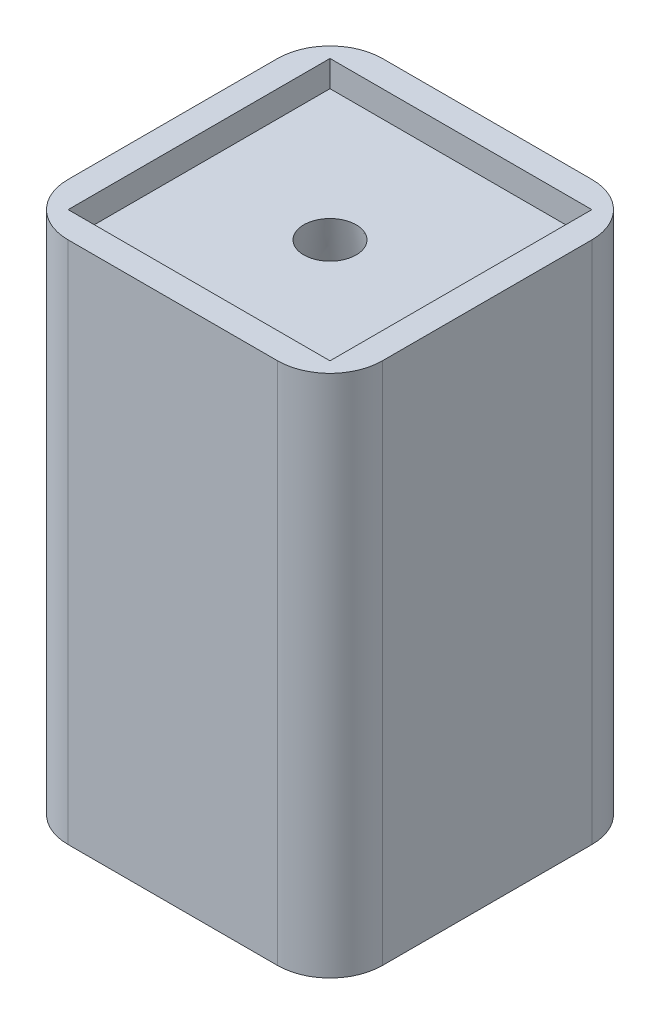
ISO-10303-21;
HEADER;
FILE_DESCRIPTION(('STEP AP214'),'2;1');
FILE_NAME('part.step','',(''),(''),'','','');
FILE_SCHEMA(('AUTOMOTIVE_DESIGN { 1 0 10303 214 1 1 1 1 }'));
ENDSEC;
DATA;
#1=APPLICATION_CONTEXT('core data for automotive mechanical design processes');
#2=APPLICATION_PROTOCOL_DEFINITION('international standard','automotive_design',2000,#1);
#3=PRODUCT_CONTEXT('',#1,'mechanical');
#4=PRODUCT('Part','Part','',(#3));
#5=PRODUCT_RELATED_PRODUCT_CATEGORY('part','',(#4));
#6=PRODUCT_DEFINITION_FORMATION('','',#4);
#7=PRODUCT_DEFINITION_CONTEXT('part definition',#1,'design');
#8=PRODUCT_DEFINITION('design','',#6,#7);
#9=PRODUCT_DEFINITION_SHAPE('','',#8);
#10=(LENGTH_UNIT() NAMED_UNIT(*) SI_UNIT(.MILLI.,.METRE.));
#11=(NAMED_UNIT(*) PLANE_ANGLE_UNIT() SI_UNIT($,.RADIAN.));
#12=(NAMED_UNIT(*) SI_UNIT($,.STERADIAN.) SOLID_ANGLE_UNIT());
#13=UNCERTAINTY_MEASURE_WITH_UNIT(LENGTH_MEASURE(1.E-05),#10,'distance_accuracy_value','');
#14=(GEOMETRIC_REPRESENTATION_CONTEXT(3) GLOBAL_UNCERTAINTY_ASSIGNED_CONTEXT((#13)) GLOBAL_UNIT_ASSIGNED_CONTEXT((#10,
#11,#12)) REPRESENTATION_CONTEXT('',''));
#15=CARTESIAN_POINT('',(0.,0.,0.));
#16=DIRECTION('',(0.,0.,1.));
#17=DIRECTION('',(1.,0.,0.));
#18=AXIS2_PLACEMENT_3D('',#15,#16,#17);
#19=CARTESIAN_POINT('',(0.,47.5,0.));
#20=DIRECTION('',(0.,-1.,0.));
#21=DIRECTION('',(0.,0.,-1.));
#22=AXIS2_PLACEMENT_3D('',#19,#20,#21);
#23=PLANE('',#22);
#24=DIRECTION('',(0.,0.,-1.));
#25=VECTOR('',#24,1.);
#26=CARTESIAN_POINT('',(12.5,47.5,12.5));
#27=LINE('',#26,#25);
#28=CARTESIAN_POINT('',(12.5,47.5,12.5));
#29=VERTEX_POINT('',#28);
#30=CARTESIAN_POINT('',(12.5,47.5,-12.5));
#31=VERTEX_POINT('',#30);
#32=EDGE_CURVE('E136',#29,#31,#27,.T.);
#33=ORIENTED_EDGE('',*,*,#32,.T.);
#34=DIRECTION('',(-1.,0.,0.));
#35=VECTOR('',#34,1.);
#36=CARTESIAN_POINT('',(-12.5,47.5,-12.5));
#37=LINE('',#36,#35);
#38=CARTESIAN_POINT('',(-12.5,47.5,-12.5));
#39=VERTEX_POINT('',#38);
#40=EDGE_CURVE('E147',#31,#39,#37,.T.);
#41=ORIENTED_EDGE('',*,*,#40,.T.);
#42=DIRECTION('',(0.,0.,1.));
#43=VECTOR('',#42,1.);
#44=CARTESIAN_POINT('',(-12.5,47.5,12.5));
#45=LINE('',#44,#43);
#46=CARTESIAN_POINT('',(-12.5,47.5,12.5));
#47=VERTEX_POINT('',#46);
#48=EDGE_CURVE('E152',#39,#47,#45,.T.);
#49=ORIENTED_EDGE('',*,*,#48,.T.);
#50=DIRECTION('',(1.,0.,0.));
#51=VECTOR('',#50,1.);
#52=CARTESIAN_POINT('',(-12.5,47.5,12.5));
#53=LINE('',#52,#51);
#54=EDGE_CURVE('E144',#47,#29,#53,.T.);
#55=ORIENTED_EDGE('',*,*,#54,.T.);
#56=EDGE_LOOP('',(#33,#41,#49,#55));
#57=FACE_BOUND('',#56,.T.);
#58=CARTESIAN_POINT('',(0.,47.5,0.));
#59=DIRECTION('',(0.,1.,0.));
#60=DIRECTION('',(0.,0.,1.));
#61=AXIS2_PLACEMENT_3D('',#58,#59,#60);
#62=CIRCLE('',#61,2.5);
#63=CARTESIAN_POINT('',(0.784484004687969,47.5,-2.37372804811097));
#64=VERTEX_POINT('',#63);
#65=EDGE_CURVE('E162',#64,#64,#62,.T.);
#66=ORIENTED_EDGE('',*,*,#65,.F.);
#67=EDGE_LOOP('',(#66));
#68=FACE_BOUND('',#67,.T.);
#69=ADVANCED_FACE('F41',(#57,#68),#23,.F.);
#70=CARTESIAN_POINT('',(15.,50.,15.));
#71=DIRECTION('',(-1.,0.,0.));
#72=DIRECTION('',(0.,0.,1.));
#73=AXIS2_PLACEMENT_3D('',#70,#71,#72);
#74=PLANE('',#73);
#75=DIRECTION('',(0.,0.,-1.));
#76=VECTOR('',#75,1.);
#77=CARTESIAN_POINT('',(15.,0.,15.));
#78=LINE('',#77,#76);
#79=CARTESIAN_POINT('',(15.,0.,10.));
#80=VERTEX_POINT('',#79);
#81=CARTESIAN_POINT('',(15.,0.,-10.));
#82=VERTEX_POINT('',#81);
#83=EDGE_CURVE('E174',#80,#82,#78,.T.);
#84=ORIENTED_EDGE('',*,*,#83,.T.);
#85=DIRECTION('',(0.,-1.,0.));
#86=VECTOR('',#85,1.);
#87=CARTESIAN_POINT('',(15.,50.,-10.));
#88=LINE('',#87,#86);
#89=CARTESIAN_POINT('',(15.,50.,-10.));
#90=VERTEX_POINT('',#89);
#91=EDGE_CURVE('E214',#82,#90,#88,.F.);
#92=ORIENTED_EDGE('',*,*,#91,.T.);
#93=DIRECTION('',(0.,0.,-1.));
#94=VECTOR('',#93,1.);
#95=CARTESIAN_POINT('',(15.,50.,15.));
#96=LINE('',#95,#94);
#97=CARTESIAN_POINT('',(15.,50.,10.));
#98=VERTEX_POINT('',#97);
#99=EDGE_CURVE('E178',#98,#90,#96,.T.);
#100=ORIENTED_EDGE('',*,*,#99,.F.);
#101=DIRECTION('',(0.,-1.,0.));
#102=VECTOR('',#101,1.);
#103=CARTESIAN_POINT('',(15.,50.,10.));
#104=LINE('',#103,#102);
#105=EDGE_CURVE('E211',#98,#80,#104,.T.);
#106=ORIENTED_EDGE('',*,*,#105,.T.);
#107=EDGE_LOOP('',(#84,#92,#100,#106));
#108=FACE_BOUND('',#107,.T.);
#109=ADVANCED_FACE('F248',(#108),#74,.F.);
#110=CARTESIAN_POINT('',(-15.,50.,-15.));
#111=DIRECTION('',(0.,0.,1.));
#112=DIRECTION('',(1.,0.,0.));
#113=AXIS2_PLACEMENT_3D('',#110,#111,#112);
#114=PLANE('',#113);
#115=DIRECTION('',(-1.,0.,0.));
#116=VECTOR('',#115,1.);
#117=CARTESIAN_POINT('',(-15.,50.,-15.));
#118=LINE('',#117,#116);
#119=CARTESIAN_POINT('',(10.,50.,-15.));
#120=VERTEX_POINT('',#119);
#121=CARTESIAN_POINT('',(-10.,50.,-15.));
#122=VERTEX_POINT('',#121);
#123=EDGE_CURVE('E181',#120,#122,#118,.T.);
#124=ORIENTED_EDGE('',*,*,#123,.F.);
#125=DIRECTION('',(0.,-1.,0.));
#126=VECTOR('',#125,1.);
#127=CARTESIAN_POINT('',(10.,50.,-15.));
#128=LINE('',#127,#126);
#129=CARTESIAN_POINT('',(10.,0.,-15.));
#130=VERTEX_POINT('',#129);
#131=EDGE_CURVE('E200',#120,#130,#128,.T.);
#132=ORIENTED_EDGE('',*,*,#131,.T.);
#133=DIRECTION('',(-1.,0.,0.));
#134=VECTOR('',#133,1.);
#135=CARTESIAN_POINT('',(-15.,0.,-15.));
#136=LINE('',#135,#134);
#137=CARTESIAN_POINT('',(-10.,0.,-15.));
#138=VERTEX_POINT('',#137);
#139=EDGE_CURVE('E192',#130,#138,#136,.T.);
#140=ORIENTED_EDGE('',*,*,#139,.T.);
#141=DIRECTION('',(0.,-1.,0.));
#142=VECTOR('',#141,1.);
#143=CARTESIAN_POINT('',(-10.,50.,-15.));
#144=LINE('',#143,#142);
#145=EDGE_CURVE('E189',#138,#122,#144,.F.);
#146=ORIENTED_EDGE('',*,*,#145,.T.);
#147=EDGE_LOOP('',(#124,#132,#140,#146));
#148=FACE_BOUND('',#147,.T.);
#149=ADVANCED_FACE('F256',(#148),#114,.F.);
#150=CARTESIAN_POINT('',(-15.,50.,15.));
#151=DIRECTION('',(1.,0.,0.));
#152=DIRECTION('',(0.,0.,-1.));
#153=AXIS2_PLACEMENT_3D('',#150,#151,#152);
#154=PLANE('',#153);
#155=DIRECTION('',(0.,0.,1.));
#156=VECTOR('',#155,1.);
#157=CARTESIAN_POINT('',(-15.,50.,15.));
#158=LINE('',#157,#156);
#159=CARTESIAN_POINT('',(-15.,50.,-10.));
#160=VERTEX_POINT('',#159);
#161=CARTESIAN_POINT('',(-15.,50.,10.));
#162=VERTEX_POINT('',#161);
#163=EDGE_CURVE('E185',#160,#162,#158,.T.);
#164=ORIENTED_EDGE('',*,*,#163,.F.);
#165=DIRECTION('',(0.,-1.,0.));
#166=VECTOR('',#165,1.);
#167=CARTESIAN_POINT('',(-15.,50.,-10.));
#168=LINE('',#167,#166);
#169=CARTESIAN_POINT('',(-15.,0.,-10.));
#170=VERTEX_POINT('',#169);
#171=EDGE_CURVE('E12',#160,#170,#168,.T.);
#172=ORIENTED_EDGE('',*,*,#171,.T.);
#173=DIRECTION('',(0.,0.,1.));
#174=VECTOR('',#173,1.);
#175=CARTESIAN_POINT('',(-15.,0.,15.));
#176=LINE('',#175,#174);
#177=CARTESIAN_POINT('',(-15.,0.,10.));
#178=VERTEX_POINT('',#177);
#179=EDGE_CURVE('E195',#170,#178,#176,.T.);
#180=ORIENTED_EDGE('',*,*,#179,.T.);
#181=DIRECTION('',(0.,-1.,0.));
#182=VECTOR('',#181,1.);
#183=CARTESIAN_POINT('',(-15.,50.,10.));
#184=LINE('',#183,#182);
#185=EDGE_CURVE('E49',#178,#162,#184,.F.);
#186=ORIENTED_EDGE('',*,*,#185,.T.);
#187=EDGE_LOOP('',(#164,#172,#180,#186));
#188=FACE_BOUND('',#187,.T.);
#189=ADVANCED_FACE('F229',(#188),#154,.F.);
#190=CARTESIAN_POINT('',(-15.,50.,15.));
#191=DIRECTION('',(0.,0.,-1.));
#192=DIRECTION('',(-1.,0.,0.));
#193=AXIS2_PLACEMENT_3D('',#190,#191,#192);
#194=PLANE('',#193);
#195=DIRECTION('',(1.,0.,0.));
#196=VECTOR('',#195,1.);
#197=CARTESIAN_POINT('',(-15.,0.,15.));
#198=LINE('',#197,#196);
#199=CARTESIAN_POINT('',(-10.,0.,15.));
#200=VERTEX_POINT('',#199);
#201=CARTESIAN_POINT('',(10.,0.,15.));
#202=VERTEX_POINT('',#201);
#203=EDGE_CURVE('E182',#200,#202,#198,.T.);
#204=ORIENTED_EDGE('',*,*,#203,.T.);
#205=DIRECTION('',(0.,-1.,0.));
#206=VECTOR('',#205,1.);
#207=CARTESIAN_POINT('',(10.,50.,15.));
#208=LINE('',#207,#206);
#209=CARTESIAN_POINT('',(10.,50.,15.));
#210=VERTEX_POINT('',#209);
#211=EDGE_CURVE('E56',#202,#210,#208,.F.);
#212=ORIENTED_EDGE('',*,*,#211,.T.);
#213=DIRECTION('',(1.,0.,0.));
#214=VECTOR('',#213,1.);
#215=CARTESIAN_POINT('',(-15.,50.,15.));
#216=LINE('',#215,#214);
#217=CARTESIAN_POINT('',(-10.,50.,15.));
#218=VERTEX_POINT('',#217);
#219=EDGE_CURVE('E187',#218,#210,#216,.T.);
#220=ORIENTED_EDGE('',*,*,#219,.F.);
#221=DIRECTION('',(0.,-1.,0.));
#222=VECTOR('',#221,1.);
#223=CARTESIAN_POINT('',(-10.,50.,15.));
#224=LINE('',#223,#222);
#225=EDGE_CURVE('E223',#218,#200,#224,.T.);
#226=ORIENTED_EDGE('',*,*,#225,.T.);
#227=EDGE_LOOP('',(#204,#212,#220,#226));
#228=FACE_BOUND('',#227,.T.);
#229=ADVANCED_FACE('F237',(#228),#194,.F.);
#230=CARTESIAN_POINT('',(0.,50.,0.));
#231=DIRECTION('',(0.,-1.,0.));
#232=DIRECTION('',(0.,0.,-1.));
#233=AXIS2_PLACEMENT_3D('',#230,#231,#232);
#234=PLANE('',#233);
#235=DIRECTION('',(-1.,0.,0.));
#236=VECTOR('',#235,1.);
#237=CARTESIAN_POINT('',(-12.5,50.,-12.5));
#238=LINE('',#237,#236);
#239=CARTESIAN_POINT('',(12.5,50.,-12.5));
#240=VERTEX_POINT('',#239);
#241=CARTESIAN_POINT('',(-12.5,50.,-12.5));
#242=VERTEX_POINT('',#241);
#243=EDGE_CURVE('E168',#240,#242,#238,.T.);
#244=ORIENTED_EDGE('',*,*,#243,.F.);
#245=DIRECTION('',(0.,0.,-1.));
#246=VECTOR('',#245,1.);
#247=CARTESIAN_POINT('',(12.5,50.,12.5));
#248=LINE('',#247,#246);
#249=CARTESIAN_POINT('',(12.5,50.,12.5));
#250=VERTEX_POINT('',#249);
#251=EDGE_CURVE('E139',#250,#240,#248,.T.);
#252=ORIENTED_EDGE('',*,*,#251,.F.);
#253=DIRECTION('',(1.,0.,0.));
#254=VECTOR('',#253,1.);
#255=CARTESIAN_POINT('',(-12.5,50.,12.5));
#256=LINE('',#255,#254);
#257=CARTESIAN_POINT('',(-12.5,50.,12.5));
#258=VERTEX_POINT('',#257);
#259=EDGE_CURVE('E156',#258,#250,#256,.T.);
#260=ORIENTED_EDGE('',*,*,#259,.F.);
#261=DIRECTION('',(0.,0.,1.));
#262=VECTOR('',#261,1.);
#263=CARTESIAN_POINT('',(-12.5,50.,12.5));
#264=LINE('',#263,#262);
#265=EDGE_CURVE('E159',#242,#258,#264,.T.);
#266=ORIENTED_EDGE('',*,*,#265,.F.);
#267=EDGE_LOOP('',(#244,#252,#260,#266));
#268=FACE_BOUND('',#267,.T.);
#269=ORIENTED_EDGE('',*,*,#99,.T.);
#270=CARTESIAN_POINT('',(10.,50.,-10.));
#271=DIRECTION('',(0.,-1.,0.));
#272=DIRECTION('',(0.,0.,-1.));
#273=AXIS2_PLACEMENT_3D('',#270,#271,#272);
#274=CIRCLE('',#273,5.);
#275=EDGE_CURVE('E221',#90,#120,#274,.F.);
#276=ORIENTED_EDGE('',*,*,#275,.T.);
#277=ORIENTED_EDGE('',*,*,#123,.T.);
#278=CARTESIAN_POINT('',(-10.,50.,-10.));
#279=DIRECTION('',(0.,-1.,0.));
#280=DIRECTION('',(0.,0.,-1.));
#281=AXIS2_PLACEMENT_3D('',#278,#279,#280);
#282=CIRCLE('',#281,5.);
#283=EDGE_CURVE('E217',#122,#160,#282,.F.);
#284=ORIENTED_EDGE('',*,*,#283,.T.);
#285=ORIENTED_EDGE('',*,*,#163,.T.);
#286=CARTESIAN_POINT('',(-10.,50.,10.));
#287=DIRECTION('',(0.,-1.,0.));
#288=DIRECTION('',(0.,0.,-1.));
#289=AXIS2_PLACEMENT_3D('',#286,#287,#288);
#290=CIRCLE('',#289,5.);
#291=EDGE_CURVE('E63',#162,#218,#290,.F.);
#292=ORIENTED_EDGE('',*,*,#291,.T.);
#293=ORIENTED_EDGE('',*,*,#219,.T.);
#294=CARTESIAN_POINT('',(10.,50.,10.));
#295=DIRECTION('',(0.,-1.,0.));
#296=DIRECTION('',(0.,0.,-1.));
#297=AXIS2_PLACEMENT_3D('',#294,#295,#296);
#298=CIRCLE('',#297,5.);
#299=EDGE_CURVE('E219',#210,#98,#298,.F.);
#300=ORIENTED_EDGE('',*,*,#299,.T.);
#301=EDGE_LOOP('',(#269,#276,#277,#284,#285,#292,#293,#300));
#302=FACE_BOUND('',#301,.T.);
#303=ADVANCED_FACE('F233',(#268,#302),#234,.F.);
#304=CARTESIAN_POINT('',(0.,0.,0.));
#305=DIRECTION('',(0.,-1.,0.));
#306=DIRECTION('',(0.,0.,-1.));
#307=AXIS2_PLACEMENT_3D('',#304,#305,#306);
#308=PLANE('',#307);
#309=CARTESIAN_POINT('',(0.,0.,0.));
#310=DIRECTION('',(0.,-1.,0.));
#311=DIRECTION('',(0.,0.,-1.));
#312=AXIS2_PLACEMENT_3D('',#309,#310,#311);
#313=CIRCLE('',#312,12.5);
#314=CARTESIAN_POINT('',(0.,0.,-12.5));
#315=VERTEX_POINT('',#314);
#316=EDGE_CURVE('E399',#315,#315,#313,.T.);
#317=ORIENTED_EDGE('',*,*,#316,.F.);
#318=EDGE_LOOP('',(#317));
#319=FACE_BOUND('',#318,.T.);
#320=ORIENTED_EDGE('',*,*,#139,.F.);
#321=CARTESIAN_POINT('',(10.,0.,-10.));
#322=DIRECTION('',(0.,-1.,0.));
#323=DIRECTION('',(0.,0.,-1.));
#324=AXIS2_PLACEMENT_3D('',#321,#322,#323);
#325=CIRCLE('',#324,5.);
#326=EDGE_CURVE('E209',#130,#82,#325,.T.);
#327=ORIENTED_EDGE('',*,*,#326,.T.);
#328=ORIENTED_EDGE('',*,*,#83,.F.);
#329=CARTESIAN_POINT('',(10.,0.,10.));
#330=DIRECTION('',(0.,-1.,0.));
#331=DIRECTION('',(0.,0.,-1.));
#332=AXIS2_PLACEMENT_3D('',#329,#330,#331);
#333=CIRCLE('',#332,5.);
#334=EDGE_CURVE('E207',#80,#202,#333,.T.);
#335=ORIENTED_EDGE('',*,*,#334,.T.);
#336=ORIENTED_EDGE('',*,*,#203,.F.);
#337=CARTESIAN_POINT('',(-10.,0.,10.));
#338=DIRECTION('',(0.,-1.,0.));
#339=DIRECTION('',(0.,0.,-1.));
#340=AXIS2_PLACEMENT_3D('',#337,#338,#339);
#341=CIRCLE('',#340,5.);
#342=EDGE_CURVE('E203',#200,#178,#341,.T.);
#343=ORIENTED_EDGE('',*,*,#342,.T.);
#344=ORIENTED_EDGE('',*,*,#179,.F.);
#345=CARTESIAN_POINT('',(-10.,0.,-10.));
#346=DIRECTION('',(0.,-1.,0.));
#347=DIRECTION('',(0.,0.,-1.));
#348=AXIS2_PLACEMENT_3D('',#345,#346,#347);
#349=CIRCLE('',#348,5.);
#350=EDGE_CURVE('E205',#170,#138,#349,.T.);
#351=ORIENTED_EDGE('',*,*,#350,.T.);
#352=EDGE_LOOP('',(#320,#327,#328,#335,#336,#343,#344,#351));
#353=FACE_BOUND('',#352,.T.);
#354=ADVANCED_FACE('F240',(#319,#353),#308,.T.);
#355=CARTESIAN_POINT('',(12.5,47.5,12.5));
#356=DIRECTION('',(1.,0.,0.));
#357=DIRECTION('',(0.,0.,-1.));
#358=AXIS2_PLACEMENT_3D('',#355,#356,#357);
#359=PLANE('',#358);
#360=ORIENTED_EDGE('',*,*,#251,.T.);
#361=DIRECTION('',(0.,1.,0.));
#362=VECTOR('',#361,1.);
#363=CARTESIAN_POINT('',(12.5,47.5,-12.5));
#364=LINE('',#363,#362);
#365=EDGE_CURVE('E132',#31,#240,#364,.T.);
#366=ORIENTED_EDGE('',*,*,#365,.F.);
#367=ORIENTED_EDGE('',*,*,#32,.F.);
#368=DIRECTION('',(0.,1.,0.));
#369=VECTOR('',#368,1.);
#370=CARTESIAN_POINT('',(12.5,47.5,12.5));
#371=LINE('',#370,#369);
#372=EDGE_CURVE('E172',#29,#250,#371,.T.);
#373=ORIENTED_EDGE('',*,*,#372,.T.);
#374=EDGE_LOOP('',(#360,#366,#367,#373));
#375=FACE_BOUND('',#374,.T.);
#376=ADVANCED_FACE('F134',(#375),#359,.F.);
#377=CARTESIAN_POINT('',(-12.5,47.5,12.5));
#378=DIRECTION('',(0.,0.,1.));
#379=DIRECTION('',(1.,0.,0.));
#380=AXIS2_PLACEMENT_3D('',#377,#378,#379);
#381=PLANE('',#380);
#382=ORIENTED_EDGE('',*,*,#259,.T.);
#383=ORIENTED_EDGE('',*,*,#372,.F.);
#384=ORIENTED_EDGE('',*,*,#54,.F.);
#385=DIRECTION('',(0.,1.,0.));
#386=VECTOR('',#385,1.);
#387=CARTESIAN_POINT('',(-12.5,47.5,12.5));
#388=LINE('',#387,#386);
#389=EDGE_CURVE('E175',#47,#258,#388,.T.);
#390=ORIENTED_EDGE('',*,*,#389,.T.);
#391=EDGE_LOOP('',(#382,#383,#384,#390));
#392=FACE_BOUND('',#391,.T.);
#393=ADVANCED_FACE('F278',(#392),#381,.F.);
#394=CARTESIAN_POINT('',(-12.5,47.5,12.5));
#395=DIRECTION('',(-1.,0.,0.));
#396=DIRECTION('',(0.,0.,1.));
#397=AXIS2_PLACEMENT_3D('',#394,#395,#396);
#398=PLANE('',#397);
#399=ORIENTED_EDGE('',*,*,#265,.T.);
#400=ORIENTED_EDGE('',*,*,#389,.F.);
#401=ORIENTED_EDGE('',*,*,#48,.F.);
#402=DIRECTION('',(0.,1.,0.));
#403=VECTOR('',#402,1.);
#404=CARTESIAN_POINT('',(-12.5,47.5,-12.5));
#405=LINE('',#404,#403);
#406=EDGE_CURVE('E143',#39,#242,#405,.T.);
#407=ORIENTED_EDGE('',*,*,#406,.T.);
#408=EDGE_LOOP('',(#399,#400,#401,#407));
#409=FACE_BOUND('',#408,.T.);
#410=ADVANCED_FACE('F281',(#409),#398,.F.);
#411=CARTESIAN_POINT('',(-12.5,47.5,-12.5));
#412=DIRECTION('',(0.,0.,-1.));
#413=DIRECTION('',(-1.,0.,0.));
#414=AXIS2_PLACEMENT_3D('',#411,#412,#413);
#415=PLANE('',#414);
#416=ORIENTED_EDGE('',*,*,#243,.T.);
#417=ORIENTED_EDGE('',*,*,#406,.F.);
#418=ORIENTED_EDGE('',*,*,#40,.F.);
#419=ORIENTED_EDGE('',*,*,#365,.T.);
#420=EDGE_LOOP('',(#416,#417,#418,#419));
#421=FACE_BOUND('',#420,.T.);
#422=ADVANCED_FACE('F148',(#421),#415,.F.);
#423=CARTESIAN_POINT('',(10.,50.,-10.));
#424=DIRECTION('',(0.,-1.,0.));
#425=DIRECTION('',(0.,0.,-1.));
#426=AXIS2_PLACEMENT_3D('',#423,#424,#425);
#427=CYLINDRICAL_SURFACE('',#426,5.);
#428=ORIENTED_EDGE('',*,*,#275,.F.);
#429=ORIENTED_EDGE('',*,*,#91,.F.);
#430=ORIENTED_EDGE('',*,*,#326,.F.);
#431=ORIENTED_EDGE('',*,*,#131,.F.);
#432=EDGE_LOOP('',(#428,#429,#430,#431));
#433=FACE_BOUND('',#432,.T.);
#434=ADVANCED_FACE('F254',(#433),#427,.T.);
#435=CARTESIAN_POINT('',(10.,50.,10.));
#436=DIRECTION('',(0.,-1.,0.));
#437=DIRECTION('',(0.,0.,-1.));
#438=AXIS2_PLACEMENT_3D('',#435,#436,#437);
#439=CYLINDRICAL_SURFACE('',#438,5.);
#440=ORIENTED_EDGE('',*,*,#299,.F.);
#441=ORIENTED_EDGE('',*,*,#211,.F.);
#442=ORIENTED_EDGE('',*,*,#334,.F.);
#443=ORIENTED_EDGE('',*,*,#105,.F.);
#444=EDGE_LOOP('',(#440,#441,#442,#443));
#445=FACE_BOUND('',#444,.T.);
#446=ADVANCED_FACE('F245',(#445),#439,.T.);
#447=CARTESIAN_POINT('',(-10.,50.,-10.));
#448=DIRECTION('',(0.,-1.,0.));
#449=DIRECTION('',(0.,0.,-1.));
#450=AXIS2_PLACEMENT_3D('',#447,#448,#449);
#451=CYLINDRICAL_SURFACE('',#450,5.);
#452=ORIENTED_EDGE('',*,*,#283,.F.);
#453=ORIENTED_EDGE('',*,*,#145,.F.);
#454=ORIENTED_EDGE('',*,*,#350,.F.);
#455=ORIENTED_EDGE('',*,*,#171,.F.);
#456=EDGE_LOOP('',(#452,#453,#454,#455));
#457=FACE_BOUND('',#456,.T.);
#458=ADVANCED_FACE('F259',(#457),#451,.T.);
#459=CARTESIAN_POINT('',(-10.,50.,10.));
#460=DIRECTION('',(0.,-1.,0.));
#461=DIRECTION('',(0.,0.,-1.));
#462=AXIS2_PLACEMENT_3D('',#459,#460,#461);
#463=CYLINDRICAL_SURFACE('',#462,5.);
#464=ORIENTED_EDGE('',*,*,#291,.F.);
#465=ORIENTED_EDGE('',*,*,#185,.F.);
#466=ORIENTED_EDGE('',*,*,#342,.F.);
#467=ORIENTED_EDGE('',*,*,#225,.F.);
#468=EDGE_LOOP('',(#464,#465,#466,#467));
#469=FACE_BOUND('',#468,.T.);
#470=ADVANCED_FACE('F43',(#469),#463,.T.);
#471=CARTESIAN_POINT('',(0.,0.,-12.5));
#472=CARTESIAN_POINT('',(0.784484004687969,47.5,-2.37372804811097));
#473=CARTESIAN_POINT('',(-25.,0.,-12.5));
#474=CARTESIAN_POINT('',(-3.96297209153398,47.5,-3.94269605748691));
#475=CARTESIAN_POINT('',(-25.,0.,12.5));
#476=CARTESIAN_POINT('',(-5.53194010090991,47.5,0.804760038735037));
#477=CARTESIAN_POINT('',(0.,0.,12.5));
#478=CARTESIAN_POINT('',(-0.784484004687968,47.5,2.37372804811097));
#479=CARTESIAN_POINT('',(25.,0.,12.5));
#480=CARTESIAN_POINT('',(3.96297209153398,47.5,3.94269605748691));
#481=CARTESIAN_POINT('',(25.,0.,-12.5));
#482=CARTESIAN_POINT('',(5.53194010090991,47.5,-0.804760038735038));
#483=CARTESIAN_POINT('',(0.,0.,-12.5));
#484=CARTESIAN_POINT('',(0.784484004687969,47.5,-2.37372804811097));
#485=(BOUNDED_SURFACE() B_SPLINE_SURFACE(3,1,((#471,#472),(#473,#474),(#475,#476),(#477,#478),
(#479,#480),(#481,#482),(#483,#484)),.UNSPECIFIED.,.T.,.F.,.F.) B_SPLINE_SURFACE_WITH_KNOTS((4,
3,4),(2,2),(0.,0.5,1.),(0.,1.),
.UNSPECIFIED.) GEOMETRIC_REPRESENTATION_ITEM() RATIONAL_B_SPLINE_SURFACE(((1.,1.),
(0.333333333333333,0.333333333333333),(0.333333333333333,0.333333333333333),(1.,1.),
(0.333333333333333,0.333333333333333),(0.333333333333333,0.333333333333333),(1.,1.))) REPRESENTATION_ITEM('') SURFACE());
#486=CARTESIAN_POINT('',(0.,0.,-12.5));
#487=CARTESIAN_POINT('',(0.00817170838216634,0.494791666666667,-12.3945180005012));
#488=CARTESIAN_POINT('',(0.0163434167643327,0.989583333333334,-12.2890360010023));
#489=CARTESIAN_POINT('',(0.0326868335286654,1.97916666666667,-12.0780720020046));
#490=CARTESIAN_POINT('',(0.0408585419108317,2.47395833333333,-11.9725900025058));
#491=CARTESIAN_POINT('',(0.0572019586751644,3.46354166666667,-11.7616260035081));
#492=CARTESIAN_POINT('',(0.0653736670573307,3.95833333333333,-11.6561440040092));
#493=CARTESIAN_POINT('',(0.0817170838216634,4.94791666666667,-11.4451800050116));
#494=CARTESIAN_POINT('',(0.0898887922038297,5.44270833333333,-11.3396980055127));
#495=CARTESIAN_POINT('',(0.106232208968162,6.43229166666667,-11.128734006515));
#496=CARTESIAN_POINT('',(0.114403917350329,6.92708333333333,-11.0232520070162));
#497=CARTESIAN_POINT('',(0.130747334114661,7.91666666666667,-10.8122880080185));
#498=CARTESIAN_POINT('',(0.138919042496828,8.41145833333333,-10.7068060085197));
#499=CARTESIAN_POINT('',(0.15526245926116,9.40104166666667,-10.495842009522));
#500=CARTESIAN_POINT('',(0.163434167643327,9.89583333333333,-10.3903600100231));
#501=CARTESIAN_POINT('',(0.179777584407659,10.8854166666667,-10.1793960110254));
#502=CARTESIAN_POINT('',(0.187949292789826,11.3802083333333,-10.0739140115266));
#503=CARTESIAN_POINT('',(0.204292709554158,12.3697916666667,-9.8629500125289));
#504=CARTESIAN_POINT('',(0.212464417936325,12.8645833333333,-9.75746801303006));
#505=CARTESIAN_POINT('',(0.228807834700657,13.8541666666667,-9.54650401403237));
#506=CARTESIAN_POINT('',(0.236979543082824,14.3489583333333,-9.44102201453352));
#507=CARTESIAN_POINT('',(0.253322959847157,15.3385416666667,-9.23005801553584));
#508=CARTESIAN_POINT('',(0.261494668229323,15.8333333333333,-9.12457601603699));
#509=CARTESIAN_POINT('',(0.277838084993656,16.8229166666667,-8.9136120170393));
#510=CARTESIAN_POINT('',(0.286009793375822,17.3177083333333,-8.80813001754046));
#511=CARTESIAN_POINT('',(0.302353210140155,18.3072916666667,-8.59716601854277));
#512=CARTESIAN_POINT('',(0.310524918522321,18.8020833333333,-8.49168401904393));
#513=CARTESIAN_POINT('',(0.326868335286654,19.7916666666667,-8.28072002004624));
#514=CARTESIAN_POINT('',(0.33504004366882,20.2864583333333,-8.1752380205474));
#515=CARTESIAN_POINT('',(0.351383460433152,21.2760416666667,-7.96427402154971));
#516=CARTESIAN_POINT('',(0.359555168815319,21.7708333333333,-7.85879202205086));
#517=CARTESIAN_POINT('',(0.375898585579652,22.7604166666667,-7.64782802305317));
#518=CARTESIAN_POINT('',(0.384070293961818,23.2552083333333,-7.54234602355433));
#519=CARTESIAN_POINT('',(0.400413710726151,24.2447916666667,-7.33138202455664));
#520=CARTESIAN_POINT('',(0.408585419108317,24.7395833333333,-7.2259000250578));
#521=CARTESIAN_POINT('',(0.42492883587265,25.7291666666667,-7.01493602606011));
#522=CARTESIAN_POINT('',(0.433100544254816,26.2239583333333,-6.90945402656127));
#523=CARTESIAN_POINT('',(0.449443961019149,27.2135416666667,-6.69849002756358));
#524=CARTESIAN_POINT('',(0.457615669401315,27.7083333333333,-6.59300802806473));
#525=CARTESIAN_POINT('',(0.473959086165648,28.6979166666667,-6.38204402906705));
#526=CARTESIAN_POINT('',(0.482130794547814,29.1927083333333,-6.2765620295682));
#527=CARTESIAN_POINT('',(0.498474211312147,30.1822916666667,-6.06559803057051));
#528=CARTESIAN_POINT('',(0.506645919694313,30.6770833333333,-5.96011603107167));
#529=CARTESIAN_POINT('',(0.522989336458646,31.6666666666667,-5.74915203207398));
#530=CARTESIAN_POINT('',(0.531161044840812,32.1614583333333,-5.64367003257514));
#531=CARTESIAN_POINT('',(0.547504461605145,33.1510416666667,-5.43270603357745));
#532=CARTESIAN_POINT('',(0.555676169987311,33.6458333333333,-5.32722403407861));
#533=CARTESIAN_POINT('',(0.572019586751644,34.6354166666667,-5.11626003508092));
#534=CARTESIAN_POINT('',(0.58019129513381,35.1302083333333,-5.01077803558207));
#535=CARTESIAN_POINT('',(0.596534711898143,36.1197916666667,-4.79981403658439));
#536=CARTESIAN_POINT('',(0.604706420280309,36.6145833333333,-4.69433203708554));
#537=CARTESIAN_POINT('',(0.621049837044642,37.6041666666667,-4.48336803808785));
#538=CARTESIAN_POINT('',(0.629221545426808,38.0989583333333,-4.37788603858901));
#539=CARTESIAN_POINT('',(0.645564962191141,39.0885416666667,-4.16692203959132));
#540=CARTESIAN_POINT('',(0.653736670573307,39.5833333333333,-4.06144004009248));
#541=CARTESIAN_POINT('',(0.67008008733764,40.5729166666667,-3.85047604109479));
#542=CARTESIAN_POINT('',(0.678251795719806,41.0677083333333,-3.74499404159595));
#543=CARTESIAN_POINT('',(0.694595212484139,42.0572916666667,-3.53403004259826));
#544=CARTESIAN_POINT('',(0.702766920866305,42.5520833333333,-3.42854804309941));
#545=CARTESIAN_POINT('',(0.719110337630638,43.5416666666667,-3.21758404410172));
#546=CARTESIAN_POINT('',(0.727282046012804,44.0364583333333,-3.11210204460288));
#547=CARTESIAN_POINT('',(0.743625462777137,45.0260416666667,-2.90113804560519));
#548=CARTESIAN_POINT('',(0.751797171159303,45.5208333333333,-2.79565604610635));
#549=CARTESIAN_POINT('',(0.768140587923636,46.5104166666667,-2.58469204710866));
#550=CARTESIAN_POINT('',(0.776312296305802,47.0052083333333,-2.47921004760982));
#551=CARTESIAN_POINT('',(0.784484004687969,47.5,-2.37372804811097));
#552=B_SPLINE_CURVE_WITH_KNOTS('',3,(#486,#487,#488,#489,#490,#491,#492,#493,#494,#495,#496,
#497,#498,#499,#500,#501,#502,#503,#504,#505,#506,#507,#508,#509,#510,#511,#512,#513,#514,#515,
#516,#517,#518,#519,#520,#521,#522,#523,#524,#525,#526,#527,#528,#529,#530,#531,#532,#533,#534,
#535,#536,#537,#538,#539,#540,#541,#542,#543,#544,#545,#546,#547,#548,#549,#550,#551),
.UNSPECIFIED.,.F.,.F.,(4,2,2,2,2,2,2,2,2,2,2,2,2,2,2,2,2,2,2,2,2,2,2,2,2,2,2,2,2,2,2,2,4),(0.,
1.51792891860931,3.03585783721861,4.55378675582792,6.07171567443722,7.58964459304653,
9.10757351165583,10.6255024302651,12.1434313488744,13.6613602674837,15.1792891860931,
16.6972181047024,18.2151470233117,19.733075941921,21.2510048605303,22.7689337791396,
24.2868626977489,25.8047916163582,27.3227205349675,28.8406494535768,30.3585783721861,
31.8765072907954,33.3944362094047,34.912365128014,36.4302940466233,37.9482229652326,
39.4661518838419,40.9840808024513,42.5020097210606,44.0199386396699,45.5378675582792,
47.0557964768885,48.5737253954978),.UNSPECIFIED.);
#553=EDGE_CURVE('BSEAM265',#315,#64,#552,.T.);
#554=ORIENTED_EDGE('',*,*,#316,.T.);
#555=ORIENTED_EDGE('',*,*,#65,.T.);
#556=ORIENTED_EDGE('',*,*,#553,.T.);
#557=ORIENTED_EDGE('',*,*,#553,.F.);
#558=EDGE_LOOP('',(#554,#556,#555,#557));
#559=FACE_BOUND('',#558,.T.);
#560=ADVANCED_FACE('F265',(#559),#485,.F.);
#561=CLOSED_SHELL('',(#69,#109,#149,#189,#229,#303,#354,#376,#393,#410,#422,#434,#446,#458,#470,#560));
#562=MANIFOLD_SOLID_BREP('B2',#561);
#563=ADVANCED_BREP_SHAPE_REPRESENTATION('',(#18,#562),#14);
#564=SHAPE_DEFINITION_REPRESENTATION(#9,#563);
ENDSEC;
END-ISO-10303-21;
